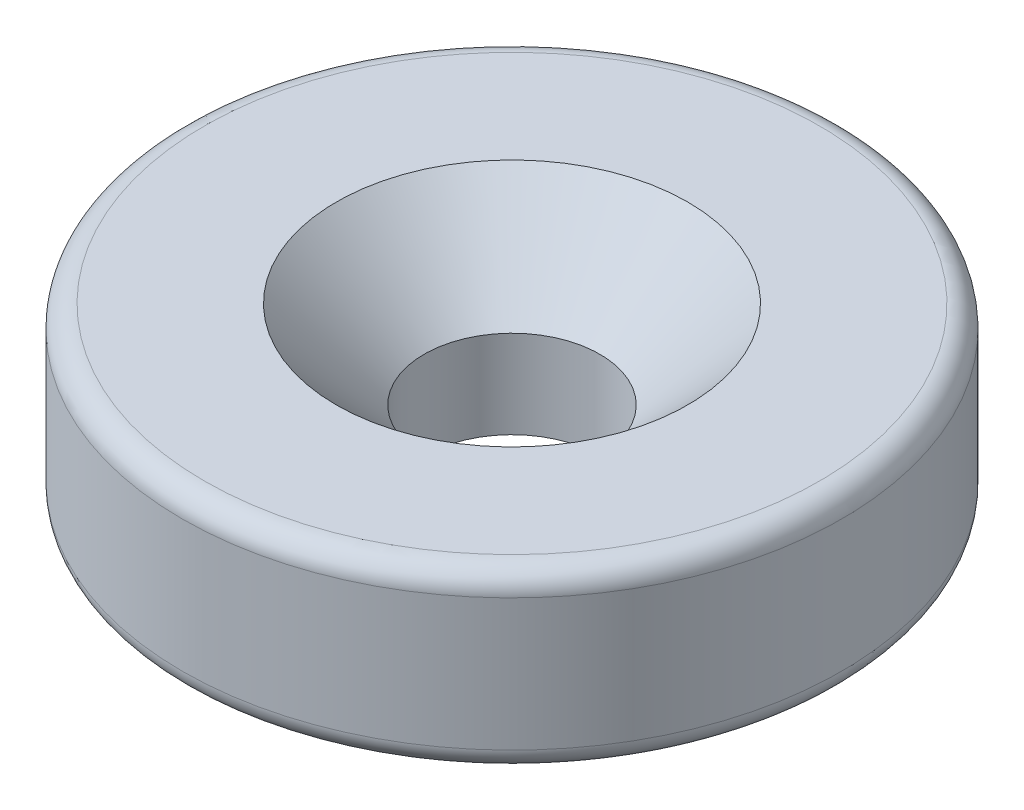
ISO-10303-21;
HEADER;
FILE_DESCRIPTION(('STEP AP214'),'2;1');
FILE_NAME('part.step','',(''),(''),'','','');
FILE_SCHEMA(('AUTOMOTIVE_DESIGN { 1 0 10303 214 1 1 1 1 }'));
ENDSEC;
DATA;
#1=APPLICATION_CONTEXT('core data for automotive mechanical design processes');
#2=APPLICATION_PROTOCOL_DEFINITION('international standard','automotive_design',2000,#1);
#3=PRODUCT_CONTEXT('',#1,'mechanical');
#4=PRODUCT('Part','Part','',(#3));
#5=PRODUCT_RELATED_PRODUCT_CATEGORY('part','',(#4));
#6=PRODUCT_DEFINITION_FORMATION('','',#4);
#7=PRODUCT_DEFINITION_CONTEXT('part definition',#1,'design');
#8=PRODUCT_DEFINITION('design','',#6,#7);
#9=PRODUCT_DEFINITION_SHAPE('','',#8);
#10=(LENGTH_UNIT() NAMED_UNIT(*) SI_UNIT(.MILLI.,.METRE.));
#11=(NAMED_UNIT(*) PLANE_ANGLE_UNIT() SI_UNIT($,.RADIAN.));
#12=(NAMED_UNIT(*) SI_UNIT($,.STERADIAN.) SOLID_ANGLE_UNIT());
#13=UNCERTAINTY_MEASURE_WITH_UNIT(LENGTH_MEASURE(1.E-05),#10,'distance_accuracy_value','');
#14=(GEOMETRIC_REPRESENTATION_CONTEXT(3) GLOBAL_UNCERTAINTY_ASSIGNED_CONTEXT((#13)) GLOBAL_UNIT_ASSIGNED_CONTEXT((#10,
#11,#12)) REPRESENTATION_CONTEXT('',''));
#15=CARTESIAN_POINT('',(0.,0.,0.));
#16=DIRECTION('',(0.,0.,1.));
#17=DIRECTION('',(1.,0.,0.));
#18=AXIS2_PLACEMENT_3D('',#15,#16,#17);
#19=CARTESIAN_POINT('',(0.,2.,0.));
#20=DIRECTION('',(0.,1.,0.));
#21=DIRECTION('',(0.,0.,1.));
#22=AXIS2_PLACEMENT_3D('',#19,#20,#21);
#23=PLANE('',#22);
#24=CARTESIAN_POINT('',(0.,2.,0.));
#25=DIRECTION('',(0.,1.,0.));
#26=DIRECTION('',(0.,0.,1.));
#27=AXIS2_PLACEMENT_3D('',#24,#25,#26);
#28=CIRCLE('',#27,4.00000000000001);
#29=CARTESIAN_POINT('',(0.,2.,4.00000000000001));
#30=VERTEX_POINT('',#29);
#31=EDGE_CURVE('E10',#30,#30,#28,.F.);
#32=ORIENTED_EDGE('',*,*,#31,.T.);
#33=EDGE_LOOP('',(#32));
#34=FACE_BOUND('',#33,.T.);
#35=CARTESIAN_POINT('',(0.,2.,0.));
#36=DIRECTION('',(0.,1.,0.));
#37=DIRECTION('',(0.,0.,1.));
#38=AXIS2_PLACEMENT_3D('',#35,#36,#37);
#39=CIRCLE('',#38,7.);
#40=CARTESIAN_POINT('',(0.,2.,7.));
#41=VERTEX_POINT('',#40);
#42=EDGE_CURVE('E42',#41,#41,#39,.T.);
#43=ORIENTED_EDGE('',*,*,#42,.T.);
#44=EDGE_LOOP('',(#43));
#45=FACE_BOUND('',#44,.T.);
#46=ADVANCED_FACE('F31',(#34,#45),#23,.T.);
#47=CARTESIAN_POINT('',(0.,-2.,0.));
#48=DIRECTION('',(0.,1.,0.));
#49=DIRECTION('',(0.,0.,1.));
#50=AXIS2_PLACEMENT_3D('',#47,#48,#49);
#51=PLANE('',#50);
#52=CARTESIAN_POINT('',(0.,-2.,0.));
#53=DIRECTION('',(0.,1.,0.));
#54=DIRECTION('',(0.,0.,1.));
#55=AXIS2_PLACEMENT_3D('',#52,#53,#54);
#56=CIRCLE('',#55,7.);
#57=CARTESIAN_POINT('',(0.,-2.,7.));
#58=VERTEX_POINT('',#57);
#59=EDGE_CURVE('E46',#58,#58,#56,.F.);
#60=ORIENTED_EDGE('',*,*,#59,.T.);
#61=EDGE_LOOP('',(#60));
#62=FACE_BOUND('',#61,.T.);
#63=CARTESIAN_POINT('',(0.,-2.,0.));
#64=DIRECTION('',(0.,1.,0.));
#65=DIRECTION('',(0.,0.,1.));
#66=AXIS2_PLACEMENT_3D('',#63,#64,#65);
#67=CIRCLE('',#66,2.);
#68=CARTESIAN_POINT('',(0.,-2.,2.));
#69=VERTEX_POINT('',#68);
#70=EDGE_CURVE('E57',#69,#69,#67,.T.);
#71=ORIENTED_EDGE('',*,*,#70,.T.);
#72=EDGE_LOOP('',(#71));
#73=FACE_BOUND('',#72,.T.);
#74=ADVANCED_FACE('F61',(#62,#73),#51,.F.);
#75=CARTESIAN_POINT('',(0.,2.,0.));
#76=DIRECTION('',(0.,-1.,0.));
#77=DIRECTION('',(0.,0.,-1.));
#78=AXIS2_PLACEMENT_3D('',#75,#76,#77);
#79=CYLINDRICAL_SURFACE('',#78,7.5);
#80=CARTESIAN_POINT('',(0.,-1.5,0.));
#81=DIRECTION('',(0.,1.,0.));
#82=DIRECTION('',(0.,0.,1.));
#83=AXIS2_PLACEMENT_3D('',#80,#81,#82);
#84=CIRCLE('',#83,7.5);
#85=CARTESIAN_POINT('',(0.,-1.5,7.5));
#86=VERTEX_POINT('',#85);
#87=EDGE_CURVE('E51',#86,#86,#84,.T.);
#88=ORIENTED_EDGE('',*,*,#87,.T.);
#89=EDGE_LOOP('',(#88));
#90=FACE_BOUND('',#89,.T.);
#91=CARTESIAN_POINT('',(0.,1.5,0.));
#92=DIRECTION('',(0.,1.,0.));
#93=DIRECTION('',(0.,0.,1.));
#94=AXIS2_PLACEMENT_3D('',#91,#92,#93);
#95=CIRCLE('',#94,7.5);
#96=CARTESIAN_POINT('',(0.,1.5,7.5));
#97=VERTEX_POINT('',#96);
#98=EDGE_CURVE('E54',#97,#97,#95,.F.);
#99=ORIENTED_EDGE('',*,*,#98,.T.);
#100=EDGE_LOOP('',(#99));
#101=FACE_BOUND('',#100,.T.);
#102=ADVANCED_FACE('F66',(#90,#101),#79,.T.);
#103=CARTESIAN_POINT('',(0.,2.,0.));
#104=DIRECTION('',(0.,-1.,0.));
#105=DIRECTION('',(0.,0.,-1.));
#106=AXIS2_PLACEMENT_3D('',#103,#104,#105);
#107=CYLINDRICAL_SURFACE('',#106,2.);
#108=CARTESIAN_POINT('',(0.,0.,0.));
#109=DIRECTION('',(0.,1.,0.));
#110=DIRECTION('',(0.,0.,1.));
#111=AXIS2_PLACEMENT_3D('',#108,#109,#110);
#112=CIRCLE('',#111,2.);
#113=CARTESIAN_POINT('',(0.,0.,2.));
#114=VERTEX_POINT('',#113);
#115=EDGE_CURVE('E38',#114,#114,#112,.T.);
#116=ORIENTED_EDGE('',*,*,#115,.T.);
#117=EDGE_LOOP('',(#116));
#118=FACE_BOUND('',#117,.T.);
#119=ORIENTED_EDGE('',*,*,#70,.F.);
#120=EDGE_LOOP('',(#119));
#121=FACE_BOUND('',#120,.T.);
#122=ADVANCED_FACE('F63',(#118,#121),#107,.F.);
#123=CARTESIAN_POINT('',(0.,-1.5,0.));
#124=DIRECTION('',(0.,1.,0.));
#125=DIRECTION('',(0.,0.,1.));
#126=AXIS2_PLACEMENT_3D('',#123,#124,#125);
#127=TOROIDAL_SURFACE('',#126,7.,0.5);
#128=ORIENTED_EDGE('',*,*,#59,.F.);
#129=EDGE_LOOP('',(#128));
#130=FACE_BOUND('',#129,.T.);
#131=ORIENTED_EDGE('',*,*,#87,.F.);
#132=EDGE_LOOP('',(#131));
#133=FACE_BOUND('',#132,.T.);
#134=ADVANCED_FACE('F65',(#130,#133),#127,.T.);
#135=CARTESIAN_POINT('',(0.,1.5,0.));
#136=DIRECTION('',(0.,1.,0.));
#137=DIRECTION('',(0.,0.,1.));
#138=AXIS2_PLACEMENT_3D('',#135,#136,#137);
#139=TOROIDAL_SURFACE('',#138,7.,0.5);
#140=ORIENTED_EDGE('',*,*,#98,.F.);
#141=EDGE_LOOP('',(#140));
#142=FACE_BOUND('',#141,.T.);
#143=ORIENTED_EDGE('',*,*,#42,.F.);
#144=EDGE_LOOP('',(#143));
#145=FACE_BOUND('',#144,.T.);
#146=ADVANCED_FACE('F72',(#142,#145),#139,.T.);
#147=CARTESIAN_POINT('',(0.,0.,0.));
#148=DIRECTION('',(0.,1.,0.));
#149=DIRECTION('',(0.,0.,1.));
#150=AXIS2_PLACEMENT_3D('',#147,#148,#149);
#151=CONICAL_SURFACE('',#150,2.,0.78539816339745);
#152=ORIENTED_EDGE('',*,*,#31,.F.);
#153=EDGE_LOOP('',(#152));
#154=FACE_BOUND('',#153,.T.);
#155=ORIENTED_EDGE('',*,*,#115,.F.);
#156=EDGE_LOOP('',(#155));
#157=FACE_BOUND('',#156,.T.);
#158=ADVANCED_FACE('F33',(#154,#157),#151,.F.);
#159=CLOSED_SHELL('',(#46,#74,#102,#122,#134,#146,#158));
#160=MANIFOLD_SOLID_BREP('B2',#159);
#161=ADVANCED_BREP_SHAPE_REPRESENTATION('',(#18,#160),#14);
#162=SHAPE_DEFINITION_REPRESENTATION(#9,#161);
ENDSEC;
END-ISO-10303-21;
